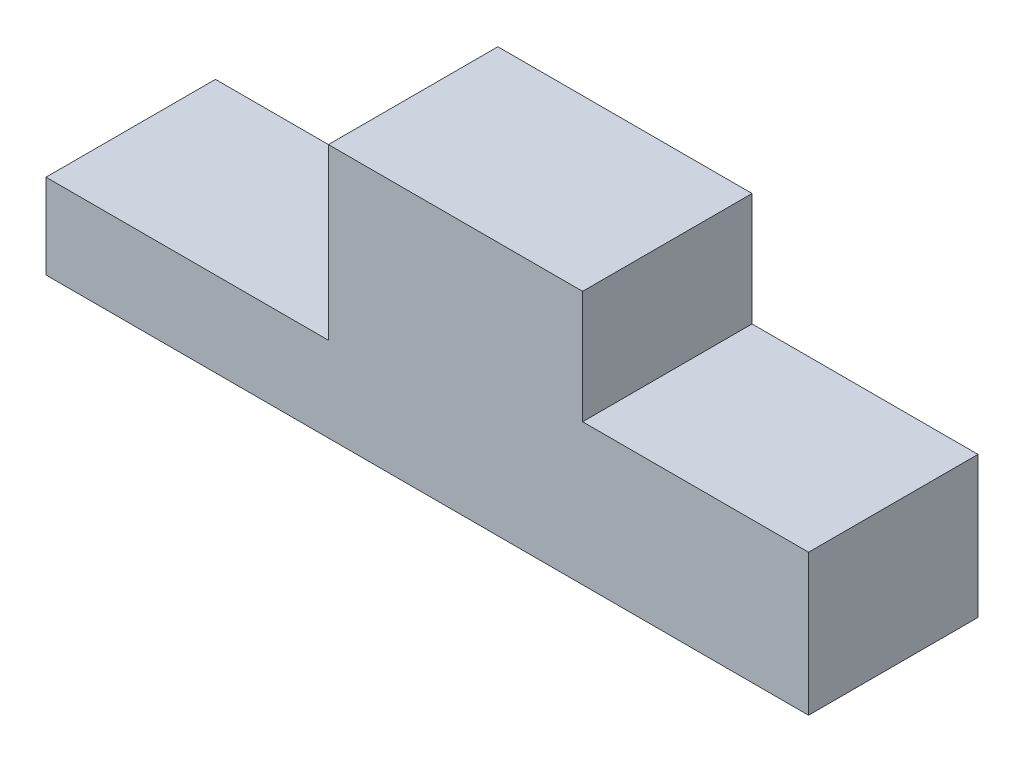
ISO-10303-21;
HEADER;
FILE_DESCRIPTION(('STEP AP214'),'2;1');
FILE_NAME('part.step','',(''),(''),'','','');
FILE_SCHEMA(('AUTOMOTIVE_DESIGN { 1 0 10303 214 1 1 1 1 }'));
ENDSEC;
DATA;
#1=APPLICATION_CONTEXT('core data for automotive mechanical design processes');
#2=APPLICATION_PROTOCOL_DEFINITION('international standard','automotive_design',2000,#1);
#3=PRODUCT_CONTEXT('',#1,'mechanical');
#4=PRODUCT('Part','Part','',(#3));
#5=PRODUCT_RELATED_PRODUCT_CATEGORY('part','',(#4));
#6=PRODUCT_DEFINITION_FORMATION('','',#4);
#7=PRODUCT_DEFINITION_CONTEXT('part definition',#1,'design');
#8=PRODUCT_DEFINITION('design','',#6,#7);
#9=PRODUCT_DEFINITION_SHAPE('','',#8);
#10=(LENGTH_UNIT() NAMED_UNIT(*) SI_UNIT(.MILLI.,.METRE.));
#11=(NAMED_UNIT(*) PLANE_ANGLE_UNIT() SI_UNIT($,.RADIAN.));
#12=(NAMED_UNIT(*) SI_UNIT($,.STERADIAN.) SOLID_ANGLE_UNIT());
#13=UNCERTAINTY_MEASURE_WITH_UNIT(LENGTH_MEASURE(1.E-05),#10,'distance_accuracy_value','');
#14=(GEOMETRIC_REPRESENTATION_CONTEXT(3) GLOBAL_UNCERTAINTY_ASSIGNED_CONTEXT((#13)) GLOBAL_UNIT_ASSIGNED_CONTEXT((#10,
#11,#12)) REPRESENTATION_CONTEXT('',''));
#15=CARTESIAN_POINT('',(0.,0.,0.));
#16=DIRECTION('',(0.,0.,1.));
#17=DIRECTION('',(1.,0.,0.));
#18=AXIS2_PLACEMENT_3D('',#15,#16,#17);
#19=CARTESIAN_POINT('',(45.,0.,15.));
#20=DIRECTION('',(-1.,0.,0.));
#21=DIRECTION('',(0.,0.,1.));
#22=AXIS2_PLACEMENT_3D('',#19,#20,#21);
#23=PLANE('',#22);
#24=DIRECTION('',(0.,0.,1.));
#25=VECTOR('',#24,1.);
#26=CARTESIAN_POINT('',(45.,25.,-15.));
#27=LINE('',#26,#25);
#28=CARTESIAN_POINT('',(45.,25.,-15.));
#29=VERTEX_POINT('',#28);
#30=CARTESIAN_POINT('',(45.,25.,15.));
#31=VERTEX_POINT('',#30);
#32=EDGE_CURVE('E54',#29,#31,#27,.T.);
#33=ORIENTED_EDGE('',*,*,#32,.F.);
#34=DIRECTION('',(0.,1.,0.));
#35=VECTOR('',#34,1.);
#36=CARTESIAN_POINT('',(45.,0.,-15.));
#37=LINE('',#36,#35);
#38=CARTESIAN_POINT('',(45.,45.,-15.));
#39=VERTEX_POINT('',#38);
#40=EDGE_CURVE('E111',#29,#39,#37,.T.);
#41=ORIENTED_EDGE('',*,*,#40,.T.);
#42=DIRECTION('',(0.,0.,-1.));
#43=VECTOR('',#42,1.);
#44=CARTESIAN_POINT('',(45.,45.,15.));
#45=LINE('',#44,#43);
#46=CARTESIAN_POINT('',(45.,45.,15.));
#47=VERTEX_POINT('',#46);
#48=EDGE_CURVE('E107',#47,#39,#45,.T.);
#49=ORIENTED_EDGE('',*,*,#48,.F.);
#50=DIRECTION('',(0.,1.,0.));
#51=VECTOR('',#50,1.);
#52=CARTESIAN_POINT('',(45.,0.,15.));
#53=LINE('',#52,#51);
#54=EDGE_CURVE('E104',#31,#47,#53,.T.);
#55=ORIENTED_EDGE('',*,*,#54,.F.);
#56=EDGE_LOOP('',(#33,#41,#49,#55));
#57=FACE_BOUND('',#56,.T.);
#58=ADVANCED_FACE('F39',(#57),#23,.F.);
#59=CARTESIAN_POINT('',(0.,15.,0.));
#60=DIRECTION('',(0.,1.,0.));
#61=DIRECTION('',(0.,0.,1.));
#62=AXIS2_PLACEMENT_3D('',#59,#60,#61);
#63=PLANE('',#62);
#64=DIRECTION('',(1.,0.,0.));
#65=VECTOR('',#64,1.);
#66=CARTESIAN_POINT('',(-50.,15.,15.));
#67=LINE('',#66,#65);
#68=CARTESIAN_POINT('',(-50.,15.,15.));
#69=VERTEX_POINT('',#68);
#70=CARTESIAN_POINT('',(0.,15.,15.));
#71=VERTEX_POINT('',#70);
#72=EDGE_CURVE('E153',#69,#71,#67,.T.);
#73=ORIENTED_EDGE('',*,*,#72,.T.);
#74=DIRECTION('',(0.,0.,-1.));
#75=VECTOR('',#74,1.);
#76=CARTESIAN_POINT('',(0.,15.,15.));
#77=LINE('',#76,#75);
#78=CARTESIAN_POINT('',(0.,15.,-15.));
#79=VERTEX_POINT('',#78);
#80=EDGE_CURVE('E142',#71,#79,#77,.T.);
#81=ORIENTED_EDGE('',*,*,#80,.T.);
#82=DIRECTION('',(-1.,0.,0.));
#83=VECTOR('',#82,1.);
#84=CARTESIAN_POINT('',(-50.,15.,-15.));
#85=LINE('',#84,#83);
#86=CARTESIAN_POINT('',(-50.,15.,-15.));
#87=VERTEX_POINT('',#86);
#88=EDGE_CURVE('E157',#79,#87,#85,.T.);
#89=ORIENTED_EDGE('',*,*,#88,.T.);
#90=DIRECTION('',(0.,0.,1.));
#91=VECTOR('',#90,1.);
#92=CARTESIAN_POINT('',(-50.,15.,-15.));
#93=LINE('',#92,#91);
#94=EDGE_CURVE('E150',#87,#69,#93,.T.);
#95=ORIENTED_EDGE('',*,*,#94,.T.);
#96=EDGE_LOOP('',(#73,#81,#89,#95));
#97=FACE_BOUND('',#96,.T.);
#98=ADVANCED_FACE('F176',(#97),#63,.T.);
#99=CARTESIAN_POINT('',(-50.,15.,-15.));
#100=DIRECTION('',(1.,0.,0.));
#101=DIRECTION('',(0.,0.,-1.));
#102=AXIS2_PLACEMENT_3D('',#99,#100,#101);
#103=PLANE('',#102);
#104=DIRECTION('',(0.,0.,1.));
#105=VECTOR('',#104,1.);
#106=CARTESIAN_POINT('',(-50.,0.,-15.));
#107=LINE('',#106,#105);
#108=CARTESIAN_POINT('',(-50.,0.,-15.));
#109=VERTEX_POINT('',#108);
#110=CARTESIAN_POINT('',(-50.,0.,15.));
#111=VERTEX_POINT('',#110);
#112=EDGE_CURVE('E110',#109,#111,#107,.T.);
#113=ORIENTED_EDGE('',*,*,#112,.T.);
#114=DIRECTION('',(0.,-1.,0.));
#115=VECTOR('',#114,1.);
#116=CARTESIAN_POINT('',(-50.,15.,15.));
#117=LINE('',#116,#115);
#118=EDGE_CURVE('E11',#69,#111,#117,.T.);
#119=ORIENTED_EDGE('',*,*,#118,.F.);
#120=ORIENTED_EDGE('',*,*,#94,.F.);
#121=DIRECTION('',(0.,-1.,0.));
#122=VECTOR('',#121,1.);
#123=CARTESIAN_POINT('',(-50.,15.,-15.));
#124=LINE('',#123,#122);
#125=EDGE_CURVE('E47',#87,#109,#124,.T.);
#126=ORIENTED_EDGE('',*,*,#125,.T.);
#127=EDGE_LOOP('',(#113,#119,#120,#126));
#128=FACE_BOUND('',#127,.T.);
#129=ADVANCED_FACE('F41',(#128),#103,.F.);
#130=CARTESIAN_POINT('',(-50.,15.,15.));
#131=DIRECTION('',(0.,0.,-1.));
#132=DIRECTION('',(-1.,0.,0.));
#133=AXIS2_PLACEMENT_3D('',#130,#131,#132);
#134=PLANE('',#133);
#135=DIRECTION('',(1.,0.,0.));
#136=VECTOR('',#135,1.);
#137=CARTESIAN_POINT('',(-50.,0.,15.));
#138=LINE('',#137,#136);
#139=CARTESIAN_POINT('',(85.,0.,15.));
#140=VERTEX_POINT('',#139);
#141=EDGE_CURVE('E161',#111,#140,#138,.T.);
#142=ORIENTED_EDGE('',*,*,#141,.T.);
#143=DIRECTION('',(0.,-1.,0.));
#144=VECTOR('',#143,1.);
#145=CARTESIAN_POINT('',(85.,25.,15.));
#146=LINE('',#145,#144);
#147=CARTESIAN_POINT('',(85.,25.,15.));
#148=VERTEX_POINT('',#147);
#149=EDGE_CURVE('E117',#148,#140,#146,.T.);
#150=ORIENTED_EDGE('',*,*,#149,.F.);
#151=DIRECTION('',(1.,0.,0.));
#152=VECTOR('',#151,1.);
#153=CARTESIAN_POINT('',(45.,25.,15.));
#154=LINE('',#153,#152);
#155=EDGE_CURVE('E114',#31,#148,#154,.T.);
#156=ORIENTED_EDGE('',*,*,#155,.F.);
#157=ORIENTED_EDGE('',*,*,#54,.T.);
#158=DIRECTION('',(-1.,0.,0.));
#159=VECTOR('',#158,1.);
#160=CARTESIAN_POINT('',(45.,45.,15.));
#161=LINE('',#160,#159);
#162=CARTESIAN_POINT('',(0.,45.,15.));
#163=VERTEX_POINT('',#162);
#164=EDGE_CURVE('E138',#47,#163,#161,.T.);
#165=ORIENTED_EDGE('',*,*,#164,.T.);
#166=DIRECTION('',(0.,-1.,0.));
#167=VECTOR('',#166,1.);
#168=CARTESIAN_POINT('',(0.,15.,15.));
#169=LINE('',#168,#167);
#170=EDGE_CURVE('E140',#163,#71,#169,.T.);
#171=ORIENTED_EDGE('',*,*,#170,.T.);
#172=ORIENTED_EDGE('',*,*,#72,.F.);
#173=ORIENTED_EDGE('',*,*,#118,.T.);
#174=EDGE_LOOP('',(#142,#150,#156,#157,#165,#171,#172,#173));
#175=FACE_BOUND('',#174,.T.);
#176=ADVANCED_FACE('F115',(#175),#134,.F.);
#177=CARTESIAN_POINT('',(-50.,15.,-15.));
#178=DIRECTION('',(0.,0.,1.));
#179=DIRECTION('',(1.,0.,0.));
#180=AXIS2_PLACEMENT_3D('',#177,#178,#179);
#181=PLANE('',#180);
#182=DIRECTION('',(-1.,0.,0.));
#183=VECTOR('',#182,1.);
#184=CARTESIAN_POINT('',(-50.,0.,-15.));
#185=LINE('',#184,#183);
#186=CARTESIAN_POINT('',(85.,0.,-15.));
#187=VERTEX_POINT('',#186);
#188=EDGE_CURVE('E154',#187,#109,#185,.T.);
#189=ORIENTED_EDGE('',*,*,#188,.T.);
#190=ORIENTED_EDGE('',*,*,#125,.F.);
#191=ORIENTED_EDGE('',*,*,#88,.F.);
#192=DIRECTION('',(0.,-1.,0.));
#193=VECTOR('',#192,1.);
#194=CARTESIAN_POINT('',(0.,15.,-15.));
#195=LINE('',#194,#193);
#196=CARTESIAN_POINT('',(0.,45.,-15.));
#197=VERTEX_POINT('',#196);
#198=EDGE_CURVE('E62',#197,#79,#195,.T.);
#199=ORIENTED_EDGE('',*,*,#198,.F.);
#200=DIRECTION('',(-1.,0.,0.));
#201=VECTOR('',#200,1.);
#202=CARTESIAN_POINT('',(45.,45.,-15.));
#203=LINE('',#202,#201);
#204=EDGE_CURVE('E137',#39,#197,#203,.T.);
#205=ORIENTED_EDGE('',*,*,#204,.F.);
#206=ORIENTED_EDGE('',*,*,#40,.F.);
#207=DIRECTION('',(-1.,0.,0.));
#208=VECTOR('',#207,1.);
#209=CARTESIAN_POINT('',(45.,25.,-15.));
#210=LINE('',#209,#208);
#211=CARTESIAN_POINT('',(85.,25.,-15.));
#212=VERTEX_POINT('',#211);
#213=EDGE_CURVE('E125',#212,#29,#210,.T.);
#214=ORIENTED_EDGE('',*,*,#213,.F.);
#215=DIRECTION('',(0.,-1.,0.));
#216=VECTOR('',#215,1.);
#217=CARTESIAN_POINT('',(85.,25.,-15.));
#218=LINE('',#217,#216);
#219=EDGE_CURVE('E132',#212,#187,#218,.T.);
#220=ORIENTED_EDGE('',*,*,#219,.T.);
#221=EDGE_LOOP('',(#189,#190,#191,#199,#205,#206,#214,#220));
#222=FACE_BOUND('',#221,.T.);
#223=ADVANCED_FACE('F177',(#222),#181,.F.);
#224=CARTESIAN_POINT('',(0.,0.,0.));
#225=DIRECTION('',(0.,1.,0.));
#226=DIRECTION('',(0.,0.,1.));
#227=AXIS2_PLACEMENT_3D('',#224,#225,#226);
#228=PLANE('',#227);
#229=ORIENTED_EDGE('',*,*,#112,.F.);
#230=ORIENTED_EDGE('',*,*,#188,.F.);
#231=DIRECTION('',(0.,0.,-1.));
#232=VECTOR('',#231,1.);
#233=CARTESIAN_POINT('',(85.,0.,-15.));
#234=LINE('',#233,#232);
#235=EDGE_CURVE('E126',#140,#187,#234,.T.);
#236=ORIENTED_EDGE('',*,*,#235,.F.);
#237=ORIENTED_EDGE('',*,*,#141,.F.);
#238=EDGE_LOOP('',(#229,#230,#236,#237));
#239=FACE_BOUND('',#238,.T.);
#240=ADVANCED_FACE('F172',(#239),#228,.F.);
#241=CARTESIAN_POINT('',(45.,45.,15.));
#242=DIRECTION('',(0.,-1.,0.));
#243=DIRECTION('',(0.,0.,-1.));
#244=AXIS2_PLACEMENT_3D('',#241,#242,#243);
#245=PLANE('',#244);
#246=ORIENTED_EDGE('',*,*,#204,.T.);
#247=DIRECTION('',(0.,0.,-1.));
#248=VECTOR('',#247,1.);
#249=CARTESIAN_POINT('',(0.,45.,15.));
#250=LINE('',#249,#248);
#251=EDGE_CURVE('E146',#163,#197,#250,.T.);
#252=ORIENTED_EDGE('',*,*,#251,.F.);
#253=ORIENTED_EDGE('',*,*,#164,.F.);
#254=ORIENTED_EDGE('',*,*,#48,.T.);
#255=EDGE_LOOP('',(#246,#252,#253,#254));
#256=FACE_BOUND('',#255,.T.);
#257=ADVANCED_FACE('F181',(#256),#245,.F.);
#258=CARTESIAN_POINT('',(0.,15.,15.));
#259=DIRECTION('',(1.,0.,0.));
#260=DIRECTION('',(0.,0.,-1.));
#261=AXIS2_PLACEMENT_3D('',#258,#259,#260);
#262=PLANE('',#261);
#263=ORIENTED_EDGE('',*,*,#198,.T.);
#264=ORIENTED_EDGE('',*,*,#80,.F.);
#265=ORIENTED_EDGE('',*,*,#170,.F.);
#266=ORIENTED_EDGE('',*,*,#251,.T.);
#267=EDGE_LOOP('',(#263,#264,#265,#266));
#268=FACE_BOUND('',#267,.T.);
#269=ADVANCED_FACE('F182',(#268),#262,.F.);
#270=CARTESIAN_POINT('',(85.,25.,-15.));
#271=DIRECTION('',(-1.,0.,0.));
#272=DIRECTION('',(0.,0.,1.));
#273=AXIS2_PLACEMENT_3D('',#270,#271,#272);
#274=PLANE('',#273);
#275=ORIENTED_EDGE('',*,*,#235,.T.);
#276=ORIENTED_EDGE('',*,*,#219,.F.);
#277=DIRECTION('',(0.,0.,-1.));
#278=VECTOR('',#277,1.);
#279=CARTESIAN_POINT('',(85.,25.,-15.));
#280=LINE('',#279,#278);
#281=EDGE_CURVE('E120',#148,#212,#280,.T.);
#282=ORIENTED_EDGE('',*,*,#281,.F.);
#283=ORIENTED_EDGE('',*,*,#149,.T.);
#284=EDGE_LOOP('',(#275,#276,#282,#283));
#285=FACE_BOUND('',#284,.T.);
#286=ADVANCED_FACE('F184',(#285),#274,.F.);
#287=CARTESIAN_POINT('',(0.,25.,0.));
#288=DIRECTION('',(0.,1.,0.));
#289=DIRECTION('',(0.,0.,1.));
#290=AXIS2_PLACEMENT_3D('',#287,#288,#289);
#291=PLANE('',#290);
#292=ORIENTED_EDGE('',*,*,#32,.T.);
#293=ORIENTED_EDGE('',*,*,#155,.T.);
#294=ORIENTED_EDGE('',*,*,#281,.T.);
#295=ORIENTED_EDGE('',*,*,#213,.T.);
#296=EDGE_LOOP('',(#292,#293,#294,#295));
#297=FACE_BOUND('',#296,.T.);
#298=ADVANCED_FACE('F123',(#297),#291,.T.);
#299=CLOSED_SHELL('',(#58,#98,#129,#176,#223,#240,#257,#269,#286,#298));
#300=MANIFOLD_SOLID_BREP('B2',#299);
#301=ADVANCED_BREP_SHAPE_REPRESENTATION('',(#18,#300),#14);
#302=SHAPE_DEFINITION_REPRESENTATION(#9,#301);
ENDSEC;
END-ISO-10303-21;
